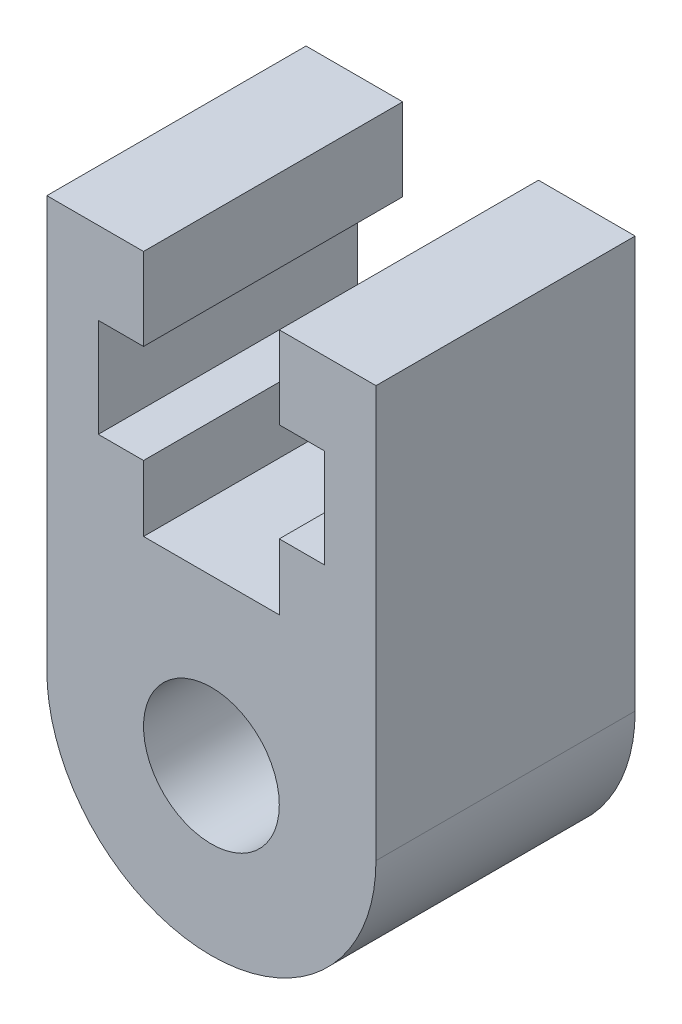
ISO-10303-21;
HEADER;
FILE_DESCRIPTION(('STEP AP214'),'2;1');
FILE_NAME('part.step','',(''),(''),'','','');
FILE_SCHEMA(('AUTOMOTIVE_DESIGN { 1 0 10303 214 1 1 1 1 }'));
ENDSEC;
DATA;
#1=APPLICATION_CONTEXT('core data for automotive mechanical design processes');
#2=APPLICATION_PROTOCOL_DEFINITION('international standard','automotive_design',2000,#1);
#3=PRODUCT_CONTEXT('',#1,'mechanical');
#4=PRODUCT('Part','Part','',(#3));
#5=PRODUCT_RELATED_PRODUCT_CATEGORY('part','',(#4));
#6=PRODUCT_DEFINITION_FORMATION('','',#4);
#7=PRODUCT_DEFINITION_CONTEXT('part definition',#1,'design');
#8=PRODUCT_DEFINITION('design','',#6,#7);
#9=PRODUCT_DEFINITION_SHAPE('','',#8);
#10=(LENGTH_UNIT() NAMED_UNIT(*) SI_UNIT(.MILLI.,.METRE.));
#11=(NAMED_UNIT(*) PLANE_ANGLE_UNIT() SI_UNIT($,.RADIAN.));
#12=(NAMED_UNIT(*) SI_UNIT($,.STERADIAN.) SOLID_ANGLE_UNIT());
#13=UNCERTAINTY_MEASURE_WITH_UNIT(LENGTH_MEASURE(1.E-05),#10,'distance_accuracy_value','');
#14=(GEOMETRIC_REPRESENTATION_CONTEXT(3) GLOBAL_UNCERTAINTY_ASSIGNED_CONTEXT((#13)) GLOBAL_UNIT_ASSIGNED_CONTEXT((#10,
#11,#12)) REPRESENTATION_CONTEXT('',''));
#15=CARTESIAN_POINT('',(0.,0.,0.));
#16=DIRECTION('',(0.,0.,1.));
#17=DIRECTION('',(1.,0.,0.));
#18=AXIS2_PLACEMENT_3D('',#15,#16,#17);
#19=CARTESIAN_POINT('',(0.,0.,6.3));
#20=DIRECTION('',(0.,0.,1.));
#21=DIRECTION('',(1.,0.,0.));
#22=AXIS2_PLACEMENT_3D('',#19,#20,#21);
#23=PLANE('',#22);
#24=CARTESIAN_POINT('',(0.,0.,6.3));
#25=DIRECTION('',(0.,0.,1.));
#26=DIRECTION('',(1.,0.,0.));
#27=AXIS2_PLACEMENT_3D('',#24,#25,#26);
#28=CIRCLE('',#27,4.);
#29=CARTESIAN_POINT('',(-4.,0.,6.3));
#30=VERTEX_POINT('',#29);
#31=CARTESIAN_POINT('',(4.,0.,6.3));
#32=VERTEX_POINT('',#31);
#33=EDGE_CURVE('E236',#30,#32,#28,.T.);
#34=ORIENTED_EDGE('',*,*,#33,.T.);
#35=DIRECTION('',(0.,1.,0.));
#36=VECTOR('',#35,1.);
#37=CARTESIAN_POINT('',(4.,0.,6.3));
#38=LINE('',#37,#36);
#39=CARTESIAN_POINT('',(4.,10.,6.3));
#40=VERTEX_POINT('',#39);
#41=EDGE_CURVE('E124',#32,#40,#38,.T.);
#42=ORIENTED_EDGE('',*,*,#41,.T.);
#43=DIRECTION('',(-1.,0.,0.));
#44=VECTOR('',#43,1.);
#45=CARTESIAN_POINT('',(4.,10.,6.3));
#46=LINE('',#45,#44);
#47=CARTESIAN_POINT('',(1.65,10.,6.3));
#48=VERTEX_POINT('',#47);
#49=EDGE_CURVE('E289',#40,#48,#46,.T.);
#50=ORIENTED_EDGE('',*,*,#49,.T.);
#51=DIRECTION('',(0.,-1.,0.));
#52=VECTOR('',#51,1.);
#53=CARTESIAN_POINT('',(1.65,10.,6.3));
#54=LINE('',#53,#52);
#55=CARTESIAN_POINT('',(1.65,8.,6.3));
#56=VERTEX_POINT('',#55);
#57=EDGE_CURVE('E309',#48,#56,#54,.T.);
#58=ORIENTED_EDGE('',*,*,#57,.T.);
#59=DIRECTION('',(1.,0.,0.));
#60=VECTOR('',#59,1.);
#61=CARTESIAN_POINT('',(1.65,8.,6.3));
#62=LINE('',#61,#60);
#63=CARTESIAN_POINT('',(2.75,8.,6.3));
#64=VERTEX_POINT('',#63);
#65=EDGE_CURVE('E305',#56,#64,#62,.T.);
#66=ORIENTED_EDGE('',*,*,#65,.T.);
#67=DIRECTION('',(0.,-1.,0.));
#68=VECTOR('',#67,1.);
#69=CARTESIAN_POINT('',(2.75,8.,6.3));
#70=LINE('',#69,#68);
#71=CARTESIAN_POINT('',(2.75,5.6,6.3));
#72=VERTEX_POINT('',#71);
#73=EDGE_CURVE('E308',#64,#72,#70,.T.);
#74=ORIENTED_EDGE('',*,*,#73,.T.);
#75=DIRECTION('',(-1.,0.,0.));
#76=VECTOR('',#75,1.);
#77=CARTESIAN_POINT('',(2.75,5.6,6.3));
#78=LINE('',#77,#76);
#79=CARTESIAN_POINT('',(1.65,5.6,6.3));
#80=VERTEX_POINT('',#79);
#81=EDGE_CURVE('E313',#72,#80,#78,.T.);
#82=ORIENTED_EDGE('',*,*,#81,.T.);
#83=DIRECTION('',(0.,-1.,0.));
#84=VECTOR('',#83,1.);
#85=CARTESIAN_POINT('',(1.65,5.6,6.3));
#86=LINE('',#85,#84);
#87=CARTESIAN_POINT('',(1.65,4.,6.3));
#88=VERTEX_POINT('',#87);
#89=EDGE_CURVE('E320',#80,#88,#86,.T.);
#90=ORIENTED_EDGE('',*,*,#89,.T.);
#91=DIRECTION('',(-1.,0.,0.));
#92=VECTOR('',#91,1.);
#93=CARTESIAN_POINT('',(-1.65,4.,6.3));
#94=LINE('',#93,#92);
#95=CARTESIAN_POINT('',(-1.65,4.,6.3));
#96=VERTEX_POINT('',#95);
#97=EDGE_CURVE('E323',#88,#96,#94,.T.);
#98=ORIENTED_EDGE('',*,*,#97,.T.);
#99=DIRECTION('',(0.,1.,0.));
#100=VECTOR('',#99,1.);
#101=CARTESIAN_POINT('',(-1.65,5.6,6.3));
#102=LINE('',#101,#100);
#103=CARTESIAN_POINT('',(-1.65,5.6,6.3));
#104=VERTEX_POINT('',#103);
#105=EDGE_CURVE('E326',#96,#104,#102,.T.);
#106=ORIENTED_EDGE('',*,*,#105,.T.);
#107=DIRECTION('',(-1.,0.,0.));
#108=VECTOR('',#107,1.);
#109=CARTESIAN_POINT('',(-2.75,5.6,6.3));
#110=LINE('',#109,#108);
#111=CARTESIAN_POINT('',(-2.75,5.6,6.3));
#112=VERTEX_POINT('',#111);
#113=EDGE_CURVE('E329',#104,#112,#110,.T.);
#114=ORIENTED_EDGE('',*,*,#113,.T.);
#115=DIRECTION('',(0.,1.,0.));
#116=VECTOR('',#115,1.);
#117=CARTESIAN_POINT('',(-2.75,8.,6.3));
#118=LINE('',#117,#116);
#119=CARTESIAN_POINT('',(-2.75,8.,6.3));
#120=VERTEX_POINT('',#119);
#121=EDGE_CURVE('E332',#112,#120,#118,.T.);
#122=ORIENTED_EDGE('',*,*,#121,.T.);
#123=DIRECTION('',(1.,0.,0.));
#124=VECTOR('',#123,1.);
#125=CARTESIAN_POINT('',(-1.65,8.,6.3));
#126=LINE('',#125,#124);
#127=CARTESIAN_POINT('',(-1.65,8.,6.3));
#128=VERTEX_POINT('',#127);
#129=EDGE_CURVE('E167',#120,#128,#126,.T.);
#130=ORIENTED_EDGE('',*,*,#129,.T.);
#131=DIRECTION('',(0.,1.,0.));
#132=VECTOR('',#131,1.);
#133=CARTESIAN_POINT('',(-1.65,10.,6.3));
#134=LINE('',#133,#132);
#135=CARTESIAN_POINT('',(-1.65,10.,6.3));
#136=VERTEX_POINT('',#135);
#137=EDGE_CURVE('E161',#128,#136,#134,.T.);
#138=ORIENTED_EDGE('',*,*,#137,.T.);
#139=DIRECTION('',(-1.,0.,0.));
#140=VECTOR('',#139,1.);
#141=CARTESIAN_POINT('',(-4.,10.,6.3));
#142=LINE('',#141,#140);
#143=CARTESIAN_POINT('',(-4.,10.,6.3));
#144=VERTEX_POINT('',#143);
#145=EDGE_CURVE('E165',#136,#144,#142,.T.);
#146=ORIENTED_EDGE('',*,*,#145,.T.);
#147=DIRECTION('',(0.,-1.,0.));
#148=VECTOR('',#147,1.);
#149=CARTESIAN_POINT('',(-4.,0.,6.3));
#150=LINE('',#149,#148);
#151=EDGE_CURVE('E57',#144,#30,#150,.T.);
#152=ORIENTED_EDGE('',*,*,#151,.T.);
#153=EDGE_LOOP('',(#34,#42,#50,#58,#66,#74,#82,#90,#98,#106,#114,#122,#130,#138,#146,#152));
#154=FACE_BOUND('',#153,.T.);
#155=CARTESIAN_POINT('',(0.,0.,6.3));
#156=DIRECTION('',(0.,0.,1.));
#157=DIRECTION('',(1.,0.,0.));
#158=AXIS2_PLACEMENT_3D('',#155,#156,#157);
#159=CIRCLE('',#158,1.65);
#160=CARTESIAN_POINT('',(1.65,0.,6.3));
#161=VERTEX_POINT('',#160);
#162=EDGE_CURVE('E194',#161,#161,#159,.T.);
#163=ORIENTED_EDGE('',*,*,#162,.F.);
#164=EDGE_LOOP('',(#163));
#165=FACE_BOUND('',#164,.T.);
#166=ADVANCED_FACE('F39',(#154,#165),#23,.T.);
#167=CARTESIAN_POINT('',(0.,0.,0.));
#168=DIRECTION('',(0.,0.,1.));
#169=DIRECTION('',(1.,0.,0.));
#170=AXIS2_PLACEMENT_3D('',#167,#168,#169);
#171=PLANE('',#170);
#172=CARTESIAN_POINT('',(0.,0.,0.));
#173=DIRECTION('',(0.,0.,1.));
#174=DIRECTION('',(1.,0.,0.));
#175=AXIS2_PLACEMENT_3D('',#172,#173,#174);
#176=CIRCLE('',#175,4.);
#177=CARTESIAN_POINT('',(-4.,0.,0.));
#178=VERTEX_POINT('',#177);
#179=CARTESIAN_POINT('',(4.,0.,0.));
#180=VERTEX_POINT('',#179);
#181=EDGE_CURVE('E189',#178,#180,#176,.T.);
#182=ORIENTED_EDGE('',*,*,#181,.F.);
#183=DIRECTION('',(0.,-1.,0.));
#184=VECTOR('',#183,1.);
#185=CARTESIAN_POINT('',(-4.,0.,0.));
#186=LINE('',#185,#184);
#187=CARTESIAN_POINT('',(-4.,10.,0.));
#188=VERTEX_POINT('',#187);
#189=EDGE_CURVE('E116',#188,#178,#186,.T.);
#190=ORIENTED_EDGE('',*,*,#189,.F.);
#191=DIRECTION('',(-1.,0.,0.));
#192=VECTOR('',#191,1.);
#193=CARTESIAN_POINT('',(-4.,10.,0.));
#194=LINE('',#193,#192);
#195=CARTESIAN_POINT('',(-1.65,10.,0.));
#196=VERTEX_POINT('',#195);
#197=EDGE_CURVE('E110',#196,#188,#194,.T.);
#198=ORIENTED_EDGE('',*,*,#197,.F.);
#199=DIRECTION('',(0.,1.,0.));
#200=VECTOR('',#199,1.);
#201=CARTESIAN_POINT('',(-1.65,10.,0.));
#202=LINE('',#201,#200);
#203=CARTESIAN_POINT('',(-1.65,8.,0.));
#204=VERTEX_POINT('',#203);
#205=EDGE_CURVE('E176',#204,#196,#202,.T.);
#206=ORIENTED_EDGE('',*,*,#205,.F.);
#207=DIRECTION('',(1.,0.,0.));
#208=VECTOR('',#207,1.);
#209=CARTESIAN_POINT('',(-1.65,8.,0.));
#210=LINE('',#209,#208);
#211=CARTESIAN_POINT('',(-2.75,8.,0.));
#212=VERTEX_POINT('',#211);
#213=EDGE_CURVE('E227',#212,#204,#210,.T.);
#214=ORIENTED_EDGE('',*,*,#213,.F.);
#215=DIRECTION('',(0.,1.,0.));
#216=VECTOR('',#215,1.);
#217=CARTESIAN_POINT('',(-2.75,8.,0.));
#218=LINE('',#217,#216);
#219=CARTESIAN_POINT('',(-2.75,5.6,0.));
#220=VERTEX_POINT('',#219);
#221=EDGE_CURVE('E224',#220,#212,#218,.T.);
#222=ORIENTED_EDGE('',*,*,#221,.F.);
#223=DIRECTION('',(-1.,0.,0.));
#224=VECTOR('',#223,1.);
#225=CARTESIAN_POINT('',(-2.75,5.6,0.));
#226=LINE('',#225,#224);
#227=CARTESIAN_POINT('',(-1.65,5.6,0.));
#228=VERTEX_POINT('',#227);
#229=EDGE_CURVE('E221',#228,#220,#226,.T.);
#230=ORIENTED_EDGE('',*,*,#229,.F.);
#231=DIRECTION('',(0.,1.,0.));
#232=VECTOR('',#231,1.);
#233=CARTESIAN_POINT('',(-1.65,5.6,0.));
#234=LINE('',#233,#232);
#235=CARTESIAN_POINT('',(-1.65,4.,0.));
#236=VERTEX_POINT('',#235);
#237=EDGE_CURVE('E218',#236,#228,#234,.T.);
#238=ORIENTED_EDGE('',*,*,#237,.F.);
#239=DIRECTION('',(-1.,0.,0.));
#240=VECTOR('',#239,1.);
#241=CARTESIAN_POINT('',(-1.65,4.,0.));
#242=LINE('',#241,#240);
#243=CARTESIAN_POINT('',(1.65,4.,0.));
#244=VERTEX_POINT('',#243);
#245=EDGE_CURVE('E215',#244,#236,#242,.T.);
#246=ORIENTED_EDGE('',*,*,#245,.F.);
#247=DIRECTION('',(0.,-1.,0.));
#248=VECTOR('',#247,1.);
#249=CARTESIAN_POINT('',(1.65,5.6,0.));
#250=LINE('',#249,#248);
#251=CARTESIAN_POINT('',(1.65,5.6,0.));
#252=VERTEX_POINT('',#251);
#253=EDGE_CURVE('E212',#252,#244,#250,.T.);
#254=ORIENTED_EDGE('',*,*,#253,.F.);
#255=DIRECTION('',(-1.,0.,0.));
#256=VECTOR('',#255,1.);
#257=CARTESIAN_POINT('',(2.75,5.6,0.));
#258=LINE('',#257,#256);
#259=CARTESIAN_POINT('',(2.75,5.6,0.));
#260=VERTEX_POINT('',#259);
#261=EDGE_CURVE('E209',#260,#252,#258,.T.);
#262=ORIENTED_EDGE('',*,*,#261,.F.);
#263=DIRECTION('',(0.,-1.,0.));
#264=VECTOR('',#263,1.);
#265=CARTESIAN_POINT('',(2.75,8.,0.));
#266=LINE('',#265,#264);
#267=CARTESIAN_POINT('',(2.75,8.,0.));
#268=VERTEX_POINT('',#267);
#269=EDGE_CURVE('E206',#268,#260,#266,.T.);
#270=ORIENTED_EDGE('',*,*,#269,.F.);
#271=DIRECTION('',(1.,0.,0.));
#272=VECTOR('',#271,1.);
#273=CARTESIAN_POINT('',(1.65,8.,0.));
#274=LINE('',#273,#272);
#275=CARTESIAN_POINT('',(1.65,8.,0.));
#276=VERTEX_POINT('',#275);
#277=EDGE_CURVE('E203',#276,#268,#274,.T.);
#278=ORIENTED_EDGE('',*,*,#277,.F.);
#279=DIRECTION('',(0.,-1.,0.));
#280=VECTOR('',#279,1.);
#281=CARTESIAN_POINT('',(1.65,10.,0.));
#282=LINE('',#281,#280);
#283=CARTESIAN_POINT('',(1.65,10.,0.));
#284=VERTEX_POINT('',#283);
#285=EDGE_CURVE('E200',#284,#276,#282,.T.);
#286=ORIENTED_EDGE('',*,*,#285,.F.);
#287=DIRECTION('',(-1.,0.,0.));
#288=VECTOR('',#287,1.);
#289=CARTESIAN_POINT('',(4.,10.,0.));
#290=LINE('',#289,#288);
#291=CARTESIAN_POINT('',(4.,10.,0.));
#292=VERTEX_POINT('',#291);
#293=EDGE_CURVE('E197',#292,#284,#290,.T.);
#294=ORIENTED_EDGE('',*,*,#293,.F.);
#295=DIRECTION('',(0.,1.,0.));
#296=VECTOR('',#295,1.);
#297=CARTESIAN_POINT('',(4.,0.,0.));
#298=LINE('',#297,#296);
#299=EDGE_CURVE('E193',#180,#292,#298,.T.);
#300=ORIENTED_EDGE('',*,*,#299,.F.);
#301=EDGE_LOOP('',(#182,#190,#198,#206,#214,#222,#230,#238,#246,#254,#262,#270,#278,#286,#294,#300));
#302=FACE_BOUND('',#301,.T.);
#303=CARTESIAN_POINT('',(0.,0.,0.));
#304=DIRECTION('',(0.,0.,1.));
#305=DIRECTION('',(1.,0.,0.));
#306=AXIS2_PLACEMENT_3D('',#303,#304,#305);
#307=CIRCLE('',#306,1.65);
#308=CARTESIAN_POINT('',(1.65,0.,0.));
#309=VERTEX_POINT('',#308);
#310=EDGE_CURVE('E533',#309,#309,#307,.T.);
#311=ORIENTED_EDGE('',*,*,#310,.T.);
#312=EDGE_LOOP('',(#311));
#313=FACE_BOUND('',#312,.T.);
#314=ADVANCED_FACE('F293',(#302,#313),#171,.F.);
#315=CARTESIAN_POINT('',(0.,0.,6.3));
#316=DIRECTION('',(0.,0.,-1.));
#317=DIRECTION('',(-1.,0.,0.));
#318=AXIS2_PLACEMENT_3D('',#315,#316,#317);
#319=CYLINDRICAL_SURFACE('',#318,4.);
#320=ORIENTED_EDGE('',*,*,#181,.T.);
#321=DIRECTION('',(0.,0.,-1.));
#322=VECTOR('',#321,1.);
#323=CARTESIAN_POINT('',(4.,0.,6.3));
#324=LINE('',#323,#322);
#325=EDGE_CURVE('E11',#32,#180,#324,.T.);
#326=ORIENTED_EDGE('',*,*,#325,.F.);
#327=ORIENTED_EDGE('',*,*,#33,.F.);
#328=DIRECTION('',(0.,0.,-1.));
#329=VECTOR('',#328,1.);
#330=CARTESIAN_POINT('',(-4.,0.,6.3));
#331=LINE('',#330,#329);
#332=EDGE_CURVE('E185',#30,#178,#331,.T.);
#333=ORIENTED_EDGE('',*,*,#332,.T.);
#334=EDGE_LOOP('',(#320,#326,#327,#333));
#335=FACE_BOUND('',#334,.T.);
#336=ADVANCED_FACE('F41',(#335),#319,.T.);
#337=CARTESIAN_POINT('',(4.,0.,6.3));
#338=DIRECTION('',(-1.,0.,0.));
#339=DIRECTION('',(0.,0.,1.));
#340=AXIS2_PLACEMENT_3D('',#337,#338,#339);
#341=PLANE('',#340);
#342=ORIENTED_EDGE('',*,*,#299,.T.);
#343=DIRECTION('',(0.,0.,-1.));
#344=VECTOR('',#343,1.);
#345=CARTESIAN_POINT('',(4.,10.,6.3));
#346=LINE('',#345,#344);
#347=EDGE_CURVE('E49',#40,#292,#346,.T.);
#348=ORIENTED_EDGE('',*,*,#347,.F.);
#349=ORIENTED_EDGE('',*,*,#41,.F.);
#350=ORIENTED_EDGE('',*,*,#325,.T.);
#351=EDGE_LOOP('',(#342,#348,#349,#350));
#352=FACE_BOUND('',#351,.T.);
#353=ADVANCED_FACE('F368',(#352),#341,.F.);
#354=CARTESIAN_POINT('',(4.,10.,6.3));
#355=DIRECTION('',(0.,-1.,0.));
#356=DIRECTION('',(0.,0.,-1.));
#357=AXIS2_PLACEMENT_3D('',#354,#355,#356);
#358=PLANE('',#357);
#359=ORIENTED_EDGE('',*,*,#293,.T.);
#360=DIRECTION('',(0.,0.,-1.));
#361=VECTOR('',#360,1.);
#362=CARTESIAN_POINT('',(1.65,10.,6.3));
#363=LINE('',#362,#361);
#364=EDGE_CURVE('E279',#48,#284,#363,.T.);
#365=ORIENTED_EDGE('',*,*,#364,.F.);
#366=ORIENTED_EDGE('',*,*,#49,.F.);
#367=ORIENTED_EDGE('',*,*,#347,.T.);
#368=EDGE_LOOP('',(#359,#365,#366,#367));
#369=FACE_BOUND('',#368,.T.);
#370=ADVANCED_FACE('F287',(#369),#358,.F.);
#371=CARTESIAN_POINT('',(1.65,10.,6.3));
#372=DIRECTION('',(1.,0.,0.));
#373=DIRECTION('',(0.,1.,0.));
#374=AXIS2_PLACEMENT_3D('',#371,#372,#373);
#375=PLANE('',#374);
#376=ORIENTED_EDGE('',*,*,#285,.T.);
#377=DIRECTION('',(0.,0.,-1.));
#378=VECTOR('',#377,1.);
#379=CARTESIAN_POINT('',(1.65,8.,6.3));
#380=LINE('',#379,#378);
#381=EDGE_CURVE('E275',#56,#276,#380,.T.);
#382=ORIENTED_EDGE('',*,*,#381,.F.);
#383=ORIENTED_EDGE('',*,*,#57,.F.);
#384=ORIENTED_EDGE('',*,*,#364,.T.);
#385=EDGE_LOOP('',(#376,#382,#383,#384));
#386=FACE_BOUND('',#385,.T.);
#387=ADVANCED_FACE('F299',(#386),#375,.F.);
#388=CARTESIAN_POINT('',(1.65,8.,6.3));
#389=DIRECTION('',(0.,1.,0.));
#390=DIRECTION('',(0.,0.,1.));
#391=AXIS2_PLACEMENT_3D('',#388,#389,#390);
#392=PLANE('',#391);
#393=ORIENTED_EDGE('',*,*,#277,.T.);
#394=DIRECTION('',(0.,0.,-1.));
#395=VECTOR('',#394,1.);
#396=CARTESIAN_POINT('',(2.75,8.,6.3));
#397=LINE('',#396,#395);
#398=EDGE_CURVE('E271',#64,#268,#397,.T.);
#399=ORIENTED_EDGE('',*,*,#398,.F.);
#400=ORIENTED_EDGE('',*,*,#65,.F.);
#401=ORIENTED_EDGE('',*,*,#381,.T.);
#402=EDGE_LOOP('',(#393,#399,#400,#401));
#403=FACE_BOUND('',#402,.T.);
#404=ADVANCED_FACE('F303',(#403),#392,.F.);
#405=CARTESIAN_POINT('',(2.75,8.,6.3));
#406=DIRECTION('',(1.,0.,0.));
#407=DIRECTION('',(0.,0.,-1.));
#408=AXIS2_PLACEMENT_3D('',#405,#406,#407);
#409=PLANE('',#408);
#410=ORIENTED_EDGE('',*,*,#269,.T.);
#411=DIRECTION('',(0.,0.,-1.));
#412=VECTOR('',#411,1.);
#413=CARTESIAN_POINT('',(2.75,5.6,6.3));
#414=LINE('',#413,#412);
#415=EDGE_CURVE('E267',#72,#260,#414,.T.);
#416=ORIENTED_EDGE('',*,*,#415,.F.);
#417=ORIENTED_EDGE('',*,*,#73,.F.);
#418=ORIENTED_EDGE('',*,*,#398,.T.);
#419=EDGE_LOOP('',(#410,#416,#417,#418));
#420=FACE_BOUND('',#419,.T.);
#421=ADVANCED_FACE('F381',(#420),#409,.F.);
#422=CARTESIAN_POINT('',(2.75,5.6,6.3));
#423=DIRECTION('',(0.,-1.,0.));
#424=DIRECTION('',(1.,0.,0.));
#425=AXIS2_PLACEMENT_3D('',#422,#423,#424);
#426=PLANE('',#425);
#427=ORIENTED_EDGE('',*,*,#261,.T.);
#428=DIRECTION('',(0.,0.,-1.));
#429=VECTOR('',#428,1.);
#430=CARTESIAN_POINT('',(1.65,5.6,6.3));
#431=LINE('',#430,#429);
#432=EDGE_CURVE('E263',#80,#252,#431,.T.);
#433=ORIENTED_EDGE('',*,*,#432,.F.);
#434=ORIENTED_EDGE('',*,*,#81,.F.);
#435=ORIENTED_EDGE('',*,*,#415,.T.);
#436=EDGE_LOOP('',(#427,#433,#434,#435));
#437=FACE_BOUND('',#436,.T.);
#438=ADVANCED_FACE('F384',(#437),#426,.F.);
#439=CARTESIAN_POINT('',(1.65,5.6,6.3));
#440=DIRECTION('',(1.,0.,0.));
#441=DIRECTION('',(0.,1.,0.));
#442=AXIS2_PLACEMENT_3D('',#439,#440,#441);
#443=PLANE('',#442);
#444=ORIENTED_EDGE('',*,*,#253,.T.);
#445=DIRECTION('',(0.,0.,-1.));
#446=VECTOR('',#445,1.);
#447=CARTESIAN_POINT('',(1.65,4.,6.3));
#448=LINE('',#447,#446);
#449=EDGE_CURVE('E259',#88,#244,#448,.T.);
#450=ORIENTED_EDGE('',*,*,#449,.F.);
#451=ORIENTED_EDGE('',*,*,#89,.F.);
#452=ORIENTED_EDGE('',*,*,#432,.T.);
#453=EDGE_LOOP('',(#444,#450,#451,#452));
#454=FACE_BOUND('',#453,.T.);
#455=ADVANCED_FACE('F388',(#454),#443,.F.);
#456=CARTESIAN_POINT('',(-1.65,4.,6.3));
#457=DIRECTION('',(0.,-1.,0.));
#458=DIRECTION('',(0.,0.,-1.));
#459=AXIS2_PLACEMENT_3D('',#456,#457,#458);
#460=PLANE('',#459);
#461=ORIENTED_EDGE('',*,*,#245,.T.);
#462=DIRECTION('',(0.,0.,-1.));
#463=VECTOR('',#462,1.);
#464=CARTESIAN_POINT('',(-1.65,4.,6.3));
#465=LINE('',#464,#463);
#466=EDGE_CURVE('E255',#96,#236,#465,.T.);
#467=ORIENTED_EDGE('',*,*,#466,.F.);
#468=ORIENTED_EDGE('',*,*,#97,.F.);
#469=ORIENTED_EDGE('',*,*,#449,.T.);
#470=EDGE_LOOP('',(#461,#467,#468,#469));
#471=FACE_BOUND('',#470,.T.);
#472=ADVANCED_FACE('F392',(#471),#460,.F.);
#473=CARTESIAN_POINT('',(-1.65,5.6,6.3));
#474=DIRECTION('',(-1.,0.,0.));
#475=DIRECTION('',(0.,-1.,0.));
#476=AXIS2_PLACEMENT_3D('',#473,#474,#475);
#477=PLANE('',#476);
#478=ORIENTED_EDGE('',*,*,#237,.T.);
#479=DIRECTION('',(0.,0.,-1.));
#480=VECTOR('',#479,1.);
#481=CARTESIAN_POINT('',(-1.65,5.6,6.3));
#482=LINE('',#481,#480);
#483=EDGE_CURVE('E251',#104,#228,#482,.T.);
#484=ORIENTED_EDGE('',*,*,#483,.F.);
#485=ORIENTED_EDGE('',*,*,#105,.F.);
#486=ORIENTED_EDGE('',*,*,#466,.T.);
#487=EDGE_LOOP('',(#478,#484,#485,#486));
#488=FACE_BOUND('',#487,.T.);
#489=ADVANCED_FACE('F396',(#488),#477,.F.);
#490=CARTESIAN_POINT('',(-2.75,5.6,6.3));
#491=DIRECTION('',(0.,-1.,0.));
#492=DIRECTION('',(1.,0.,0.));
#493=AXIS2_PLACEMENT_3D('',#490,#491,#492);
#494=PLANE('',#493);
#495=ORIENTED_EDGE('',*,*,#229,.T.);
#496=DIRECTION('',(0.,0.,-1.));
#497=VECTOR('',#496,1.);
#498=CARTESIAN_POINT('',(-2.75,5.6,6.3));
#499=LINE('',#498,#497);
#500=EDGE_CURVE('E247',#112,#220,#499,.T.);
#501=ORIENTED_EDGE('',*,*,#500,.F.);
#502=ORIENTED_EDGE('',*,*,#113,.F.);
#503=ORIENTED_EDGE('',*,*,#483,.T.);
#504=EDGE_LOOP('',(#495,#501,#502,#503));
#505=FACE_BOUND('',#504,.T.);
#506=ADVANCED_FACE('F400',(#505),#494,.F.);
#507=CARTESIAN_POINT('',(-2.75,8.,6.3));
#508=DIRECTION('',(-1.,0.,0.));
#509=DIRECTION('',(0.,0.,1.));
#510=AXIS2_PLACEMENT_3D('',#507,#508,#509);
#511=PLANE('',#510);
#512=ORIENTED_EDGE('',*,*,#221,.T.);
#513=DIRECTION('',(0.,0.,-1.));
#514=VECTOR('',#513,1.);
#515=CARTESIAN_POINT('',(-2.75,8.,6.3));
#516=LINE('',#515,#514);
#517=EDGE_CURVE('E243',#120,#212,#516,.T.);
#518=ORIENTED_EDGE('',*,*,#517,.F.);
#519=ORIENTED_EDGE('',*,*,#121,.F.);
#520=ORIENTED_EDGE('',*,*,#500,.T.);
#521=EDGE_LOOP('',(#512,#518,#519,#520));
#522=FACE_BOUND('',#521,.T.);
#523=ADVANCED_FACE('F340',(#522),#511,.F.);
#524=CARTESIAN_POINT('',(-1.65,8.,6.3));
#525=DIRECTION('',(0.,1.,0.));
#526=DIRECTION('',(0.,0.,1.));
#527=AXIS2_PLACEMENT_3D('',#524,#525,#526);
#528=PLANE('',#527);
#529=ORIENTED_EDGE('',*,*,#213,.T.);
#530=DIRECTION('',(0.,0.,-1.));
#531=VECTOR('',#530,1.);
#532=CARTESIAN_POINT('',(-1.65,8.,6.3));
#533=LINE('',#532,#531);
#534=EDGE_CURVE('E178',#128,#204,#533,.T.);
#535=ORIENTED_EDGE('',*,*,#534,.F.);
#536=ORIENTED_EDGE('',*,*,#129,.F.);
#537=ORIENTED_EDGE('',*,*,#517,.T.);
#538=EDGE_LOOP('',(#529,#535,#536,#537));
#539=FACE_BOUND('',#538,.T.);
#540=ADVANCED_FACE('F344',(#539),#528,.F.);
#541=CARTESIAN_POINT('',(-1.65,10.,6.3));
#542=DIRECTION('',(-1.,0.,0.));
#543=DIRECTION('',(0.,-1.,0.));
#544=AXIS2_PLACEMENT_3D('',#541,#542,#543);
#545=PLANE('',#544);
#546=ORIENTED_EDGE('',*,*,#205,.T.);
#547=DIRECTION('',(0.,0.,-1.));
#548=VECTOR('',#547,1.);
#549=CARTESIAN_POINT('',(-1.65,10.,6.3));
#550=LINE('',#549,#548);
#551=EDGE_CURVE('E173',#136,#196,#550,.T.);
#552=ORIENTED_EDGE('',*,*,#551,.F.);
#553=ORIENTED_EDGE('',*,*,#137,.F.);
#554=ORIENTED_EDGE('',*,*,#534,.T.);
#555=EDGE_LOOP('',(#546,#552,#553,#554));
#556=FACE_BOUND('',#555,.T.);
#557=ADVANCED_FACE('F174',(#556),#545,.F.);
#558=CARTESIAN_POINT('',(-4.,10.,6.3));
#559=DIRECTION('',(0.,-1.,0.));
#560=DIRECTION('',(0.,0.,-1.));
#561=AXIS2_PLACEMENT_3D('',#558,#559,#560);
#562=PLANE('',#561);
#563=ORIENTED_EDGE('',*,*,#197,.T.);
#564=DIRECTION('',(0.,0.,-1.));
#565=VECTOR('',#564,1.);
#566=CARTESIAN_POINT('',(-4.,10.,6.3));
#567=LINE('',#566,#565);
#568=EDGE_CURVE('E179',#144,#188,#567,.T.);
#569=ORIENTED_EDGE('',*,*,#568,.F.);
#570=ORIENTED_EDGE('',*,*,#145,.F.);
#571=ORIENTED_EDGE('',*,*,#551,.T.);
#572=EDGE_LOOP('',(#563,#569,#570,#571));
#573=FACE_BOUND('',#572,.T.);
#574=ADVANCED_FACE('F181',(#573),#562,.F.);
#575=CARTESIAN_POINT('',(-4.,0.,6.3));
#576=DIRECTION('',(1.,0.,0.));
#577=DIRECTION('',(0.,0.,-1.));
#578=AXIS2_PLACEMENT_3D('',#575,#576,#577);
#579=PLANE('',#578);
#580=ORIENTED_EDGE('',*,*,#189,.T.);
#581=ORIENTED_EDGE('',*,*,#332,.F.);
#582=ORIENTED_EDGE('',*,*,#151,.F.);
#583=ORIENTED_EDGE('',*,*,#568,.T.);
#584=EDGE_LOOP('',(#580,#581,#582,#583));
#585=FACE_BOUND('',#584,.T.);
#586=ADVANCED_FACE('F348',(#585),#579,.F.);
#587=CARTESIAN_POINT('',(0.,0.,6.3));
#588=DIRECTION('',(0.,0.,-1.));
#589=DIRECTION('',(-1.,0.,0.));
#590=AXIS2_PLACEMENT_3D('',#587,#588,#589);
#591=CYLINDRICAL_SURFACE('',#590,1.65);
#592=ORIENTED_EDGE('',*,*,#162,.T.);
#593=EDGE_LOOP('',(#592));
#594=FACE_BOUND('',#593,.T.);
#595=ORIENTED_EDGE('',*,*,#310,.F.);
#596=EDGE_LOOP('',(#595));
#597=FACE_BOUND('',#596,.T.);
#598=ADVANCED_FACE('F350',(#594,#597),#591,.F.);
#599=CLOSED_SHELL('',(#166,#314,#336,#353,#370,#387,#404,#421,#438,#455,#472,#489,#506,#523,
#540,#557,#574,#586,#598));
#600=MANIFOLD_SOLID_BREP('B2',#599);
#601=ADVANCED_BREP_SHAPE_REPRESENTATION('',(#18,#600),#14);
#602=SHAPE_DEFINITION_REPRESENTATION(#9,#601);
ENDSEC;
END-ISO-10303-21;
